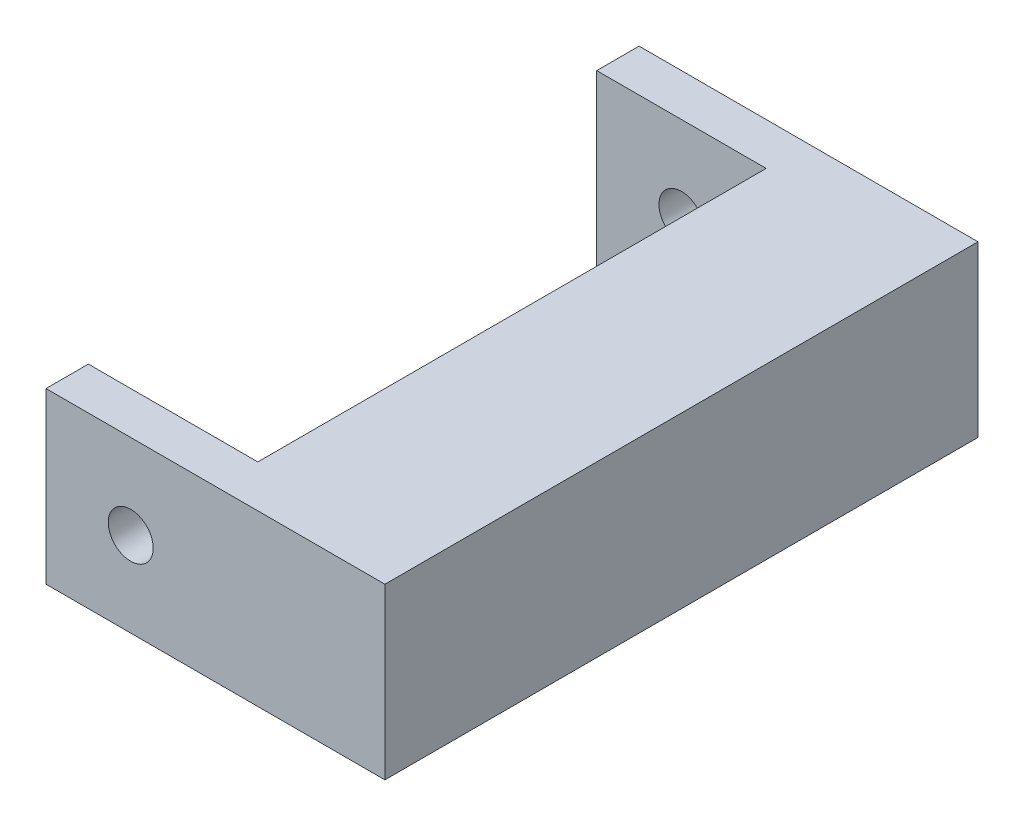
ISO-10303-21;
HEADER;
FILE_DESCRIPTION(('STEP AP214'),'2;1');
FILE_NAME('part.step','',(''),(''),'','','');
FILE_SCHEMA(('AUTOMOTIVE_DESIGN { 1 0 10303 214 1 1 1 1 }'));
ENDSEC;
DATA;
#1=APPLICATION_CONTEXT('core data for automotive mechanical design processes');
#2=APPLICATION_PROTOCOL_DEFINITION('international standard','automotive_design',2000,#1);
#3=PRODUCT_CONTEXT('',#1,'mechanical');
#4=PRODUCT('Part','Part','',(#3));
#5=PRODUCT_RELATED_PRODUCT_CATEGORY('part','',(#4));
#6=PRODUCT_DEFINITION_FORMATION('','',#4);
#7=PRODUCT_DEFINITION_CONTEXT('part definition',#1,'design');
#8=PRODUCT_DEFINITION('design','',#6,#7);
#9=PRODUCT_DEFINITION_SHAPE('','',#8);
#10=(LENGTH_UNIT() NAMED_UNIT(*) SI_UNIT(.MILLI.,.METRE.));
#11=(NAMED_UNIT(*) PLANE_ANGLE_UNIT() SI_UNIT($,.RADIAN.));
#12=(NAMED_UNIT(*) SI_UNIT($,.STERADIAN.) SOLID_ANGLE_UNIT());
#13=UNCERTAINTY_MEASURE_WITH_UNIT(LENGTH_MEASURE(1.E-05),#10,'distance_accuracy_value','');
#14=(GEOMETRIC_REPRESENTATION_CONTEXT(3) GLOBAL_UNCERTAINTY_ASSIGNED_CONTEXT((#13)) GLOBAL_UNIT_ASSIGNED_CONTEXT((#10,
#11,#12)) REPRESENTATION_CONTEXT('',''));
#15=CARTESIAN_POINT('',(0.,0.,0.));
#16=DIRECTION('',(0.,0.,1.));
#17=DIRECTION('',(1.,0.,0.));
#18=AXIS2_PLACEMENT_3D('',#15,#16,#17);
#19=CARTESIAN_POINT('',(0.,10.,5.));
#20=DIRECTION('',(0.,1.,0.));
#21=DIRECTION('',(0.,0.,1.));
#22=AXIS2_PLACEMENT_3D('',#19,#20,#21);
#23=PLANE('',#22);
#24=DIRECTION('',(1.,0.,0.));
#25=VECTOR('',#24,1.);
#26=CARTESIAN_POINT('',(0.,10.,0.));
#27=LINE('',#26,#25);
#28=CARTESIAN_POINT('',(-10.,10.,0.));
#29=VERTEX_POINT('',#28);
#30=CARTESIAN_POINT('',(30.,10.,0.));
#31=VERTEX_POINT('',#30);
#32=EDGE_CURVE('E141',#29,#31,#27,.T.);
#33=ORIENTED_EDGE('',*,*,#32,.F.);
#34=DIRECTION('',(0.,0.,-1.));
#35=VECTOR('',#34,1.);
#36=CARTESIAN_POINT('',(-10.,10.,5.));
#37=LINE('',#36,#35);
#38=CARTESIAN_POINT('',(-10.,10.,5.));
#39=VERTEX_POINT('',#38);
#40=EDGE_CURVE('E12',#39,#29,#37,.T.);
#41=ORIENTED_EDGE('',*,*,#40,.F.);
#42=DIRECTION('',(1.,0.,0.));
#43=VECTOR('',#42,1.);
#44=CARTESIAN_POINT('',(0.,10.,5.));
#45=LINE('',#44,#43);
#46=CARTESIAN_POINT('',(10.,10.,5.));
#47=VERTEX_POINT('',#46);
#48=EDGE_CURVE('E123',#39,#47,#45,.T.);
#49=ORIENTED_EDGE('',*,*,#48,.T.);
#50=DIRECTION('',(0.,0.,-1.));
#51=VECTOR('',#50,1.);
#52=CARTESIAN_POINT('',(10.,10.,70.));
#53=LINE('',#52,#51);
#54=CARTESIAN_POINT('',(10.,10.,65.));
#55=VERTEX_POINT('',#54);
#56=EDGE_CURVE('E107',#55,#47,#53,.T.);
#57=ORIENTED_EDGE('',*,*,#56,.F.);
#58=DIRECTION('',(-1.,0.,0.));
#59=VECTOR('',#58,1.);
#60=CARTESIAN_POINT('',(0.,10.,65.));
#61=LINE('',#60,#59);
#62=CARTESIAN_POINT('',(-10.,10.,65.));
#63=VERTEX_POINT('',#62);
#64=EDGE_CURVE('E344',#55,#63,#61,.T.);
#65=ORIENTED_EDGE('',*,*,#64,.T.);
#66=DIRECTION('',(0.,0.,1.));
#67=VECTOR('',#66,1.);
#68=CARTESIAN_POINT('',(-10.,10.,65.));
#69=LINE('',#68,#67);
#70=CARTESIAN_POINT('',(-10.,10.,70.));
#71=VERTEX_POINT('',#70);
#72=EDGE_CURVE('E185',#63,#71,#69,.T.);
#73=ORIENTED_EDGE('',*,*,#72,.T.);
#74=DIRECTION('',(1.,0.,0.));
#75=VECTOR('',#74,1.);
#76=CARTESIAN_POINT('',(0.,10.,70.));
#77=LINE('',#76,#75);
#78=CARTESIAN_POINT('',(30.,10.,70.));
#79=VERTEX_POINT('',#78);
#80=EDGE_CURVE('E167',#71,#79,#77,.T.);
#81=ORIENTED_EDGE('',*,*,#80,.T.);
#82=DIRECTION('',(0.,0.,-1.));
#83=VECTOR('',#82,1.);
#84=CARTESIAN_POINT('',(30.,10.,70.));
#85=LINE('',#84,#83);
#86=EDGE_CURVE('E118',#79,#31,#85,.T.);
#87=ORIENTED_EDGE('',*,*,#86,.T.);
#88=EDGE_LOOP('',(#33,#41,#49,#57,#65,#73,#81,#87));
#89=FACE_BOUND('',#88,.T.);
#90=ADVANCED_FACE('F60',(#89),#23,.T.);
#91=CARTESIAN_POINT('',(-10.,0.,5.));
#92=DIRECTION('',(1.,0.,0.));
#93=DIRECTION('',(0.,1.,0.));
#94=AXIS2_PLACEMENT_3D('',#91,#92,#93);
#95=PLANE('',#94);
#96=DIRECTION('',(0.,-1.,0.));
#97=VECTOR('',#96,1.);
#98=CARTESIAN_POINT('',(-10.,0.,0.));
#99=LINE('',#98,#97);
#100=CARTESIAN_POINT('',(-10.,-10.,0.));
#101=VERTEX_POINT('',#100);
#102=EDGE_CURVE('E145',#29,#101,#99,.T.);
#103=ORIENTED_EDGE('',*,*,#102,.T.);
#104=DIRECTION('',(0.,0.,-1.));
#105=VECTOR('',#104,1.);
#106=CARTESIAN_POINT('',(-10.,-10.,5.));
#107=LINE('',#106,#105);
#108=CARTESIAN_POINT('',(-10.,-10.,5.));
#109=VERTEX_POINT('',#108);
#110=EDGE_CURVE('E70',#109,#101,#107,.T.);
#111=ORIENTED_EDGE('',*,*,#110,.F.);
#112=DIRECTION('',(0.,-1.,0.));
#113=VECTOR('',#112,1.);
#114=CARTESIAN_POINT('',(-10.,0.,5.));
#115=LINE('',#114,#113);
#116=EDGE_CURVE('E129',#39,#109,#115,.T.);
#117=ORIENTED_EDGE('',*,*,#116,.F.);
#118=ORIENTED_EDGE('',*,*,#40,.T.);
#119=EDGE_LOOP('',(#103,#111,#117,#118));
#120=FACE_BOUND('',#119,.T.);
#121=ADVANCED_FACE('F156',(#120),#95,.F.);
#122=CARTESIAN_POINT('',(0.,0.,5.));
#123=DIRECTION('',(0.,0.,-1.));
#124=DIRECTION('',(-1.,0.,0.));
#125=AXIS2_PLACEMENT_3D('',#122,#123,#124);
#126=CYLINDRICAL_SURFACE('',#125,2.655);
#127=CARTESIAN_POINT('',(0.,0.,5.));
#128=DIRECTION('',(0.,0.,1.));
#129=DIRECTION('',(1.,0.,0.));
#130=AXIS2_PLACEMENT_3D('',#127,#128,#129);
#131=CIRCLE('',#130,2.655);
#132=CARTESIAN_POINT('',(2.655,0.,5.));
#133=VERTEX_POINT('',#132);
#134=EDGE_CURVE('E125',#133,#133,#131,.T.);
#135=ORIENTED_EDGE('',*,*,#134,.T.);
#136=EDGE_LOOP('',(#135));
#137=FACE_BOUND('',#136,.T.);
#138=CARTESIAN_POINT('',(0.,0.,0.));
#139=DIRECTION('',(0.,0.,1.));
#140=DIRECTION('',(1.,0.,0.));
#141=AXIS2_PLACEMENT_3D('',#138,#139,#140);
#142=CIRCLE('',#141,2.655);
#143=CARTESIAN_POINT('',(2.655,0.,0.));
#144=VERTEX_POINT('',#143);
#145=EDGE_CURVE('E137',#144,#144,#142,.T.);
#146=ORIENTED_EDGE('',*,*,#145,.F.);
#147=EDGE_LOOP('',(#146));
#148=FACE_BOUND('',#147,.T.);
#149=ADVANCED_FACE('F62',(#137,#148),#126,.F.);
#150=CARTESIAN_POINT('',(0.,-10.,5.));
#151=DIRECTION('',(0.,1.,0.));
#152=DIRECTION('',(0.,0.,1.));
#153=AXIS2_PLACEMENT_3D('',#150,#151,#152);
#154=PLANE('',#153);
#155=DIRECTION('',(1.,0.,0.));
#156=VECTOR('',#155,1.);
#157=CARTESIAN_POINT('',(0.,-10.,0.));
#158=LINE('',#157,#156);
#159=CARTESIAN_POINT('',(30.,-10.,0.));
#160=VERTEX_POINT('',#159);
#161=EDGE_CURVE('E148',#101,#160,#158,.T.);
#162=ORIENTED_EDGE('',*,*,#161,.T.);
#163=DIRECTION('',(0.,0.,-1.));
#164=VECTOR('',#163,1.);
#165=CARTESIAN_POINT('',(30.,-10.,70.));
#166=LINE('',#165,#164);
#167=CARTESIAN_POINT('',(30.,-10.,70.));
#168=VERTEX_POINT('',#167);
#169=EDGE_CURVE('E176',#168,#160,#166,.T.);
#170=ORIENTED_EDGE('',*,*,#169,.F.);
#171=DIRECTION('',(1.,0.,0.));
#172=VECTOR('',#171,1.);
#173=CARTESIAN_POINT('',(0.,-10.,70.));
#174=LINE('',#173,#172);
#175=CARTESIAN_POINT('',(-10.,-10.,70.));
#176=VERTEX_POINT('',#175);
#177=EDGE_CURVE('E189',#176,#168,#174,.T.);
#178=ORIENTED_EDGE('',*,*,#177,.F.);
#179=DIRECTION('',(0.,0.,1.));
#180=VECTOR('',#179,1.);
#181=CARTESIAN_POINT('',(-10.,-10.,65.));
#182=LINE('',#181,#180);
#183=CARTESIAN_POINT('',(-10.,-10.,65.));
#184=VERTEX_POINT('',#183);
#185=EDGE_CURVE('E179',#184,#176,#182,.T.);
#186=ORIENTED_EDGE('',*,*,#185,.F.);
#187=DIRECTION('',(-1.,0.,0.));
#188=VECTOR('',#187,1.);
#189=CARTESIAN_POINT('',(0.,-10.,65.));
#190=LINE('',#189,#188);
#191=CARTESIAN_POINT('',(10.,-10.,65.));
#192=VERTEX_POINT('',#191);
#193=EDGE_CURVE('E336',#192,#184,#190,.T.);
#194=ORIENTED_EDGE('',*,*,#193,.F.);
#195=DIRECTION('',(0.,0.,-1.));
#196=VECTOR('',#195,1.);
#197=CARTESIAN_POINT('',(10.,-10.,70.));
#198=LINE('',#197,#196);
#199=CARTESIAN_POINT('',(10.,-10.,5.));
#200=VERTEX_POINT('',#199);
#201=EDGE_CURVE('E95',#192,#200,#198,.T.);
#202=ORIENTED_EDGE('',*,*,#201,.T.);
#203=DIRECTION('',(1.,0.,0.));
#204=VECTOR('',#203,1.);
#205=CARTESIAN_POINT('',(0.,-10.,5.));
#206=LINE('',#205,#204);
#207=EDGE_CURVE('E78',#109,#200,#206,.T.);
#208=ORIENTED_EDGE('',*,*,#207,.F.);
#209=ORIENTED_EDGE('',*,*,#110,.T.);
#210=EDGE_LOOP('',(#162,#170,#178,#186,#194,#202,#208,#209));
#211=FACE_BOUND('',#210,.T.);
#212=ADVANCED_FACE('F153',(#211),#154,.F.);
#213=CARTESIAN_POINT('',(0.,0.,5.));
#214=DIRECTION('',(0.,0.,1.));
#215=DIRECTION('',(1.,0.,0.));
#216=AXIS2_PLACEMENT_3D('',#213,#214,#215);
#217=PLANE('',#216);
#218=ORIENTED_EDGE('',*,*,#134,.F.);
#219=EDGE_LOOP('',(#218));
#220=FACE_BOUND('',#219,.T.);
#221=DIRECTION('',(0.,-1.,0.));
#222=VECTOR('',#221,1.);
#223=CARTESIAN_POINT('',(10.,0.,5.));
#224=LINE('',#223,#222);
#225=EDGE_CURVE('E110',#47,#200,#224,.T.);
#226=ORIENTED_EDGE('',*,*,#225,.F.);
#227=ORIENTED_EDGE('',*,*,#48,.F.);
#228=ORIENTED_EDGE('',*,*,#116,.T.);
#229=ORIENTED_EDGE('',*,*,#207,.T.);
#230=EDGE_LOOP('',(#226,#227,#228,#229));
#231=FACE_BOUND('',#230,.T.);
#232=ADVANCED_FACE('F122',(#220,#231),#217,.T.);
#233=CARTESIAN_POINT('',(0.,0.,0.));
#234=DIRECTION('',(0.,0.,1.));
#235=DIRECTION('',(1.,0.,0.));
#236=AXIS2_PLACEMENT_3D('',#233,#234,#235);
#237=PLANE('',#236);
#238=ORIENTED_EDGE('',*,*,#145,.T.);
#239=EDGE_LOOP('',(#238));
#240=FACE_BOUND('',#239,.T.);
#241=ORIENTED_EDGE('',*,*,#32,.T.);
#242=DIRECTION('',(0.,-1.,0.));
#243=VECTOR('',#242,1.);
#244=CARTESIAN_POINT('',(30.,0.,0.));
#245=LINE('',#244,#243);
#246=EDGE_CURVE('E174',#31,#160,#245,.T.);
#247=ORIENTED_EDGE('',*,*,#246,.T.);
#248=ORIENTED_EDGE('',*,*,#161,.F.);
#249=ORIENTED_EDGE('',*,*,#102,.F.);
#250=EDGE_LOOP('',(#241,#247,#248,#249));
#251=FACE_BOUND('',#250,.T.);
#252=ADVANCED_FACE('F158',(#240,#251),#237,.F.);
#253=CARTESIAN_POINT('',(10.,0.,70.));
#254=DIRECTION('',(1.,0.,0.));
#255=DIRECTION('',(0.,1.,0.));
#256=AXIS2_PLACEMENT_3D('',#253,#254,#255);
#257=PLANE('',#256);
#258=ORIENTED_EDGE('',*,*,#201,.F.);
#259=DIRECTION('',(0.,1.,0.));
#260=VECTOR('',#259,1.);
#261=CARTESIAN_POINT('',(10.,0.,65.));
#262=LINE('',#261,#260);
#263=EDGE_CURVE('E113',#192,#55,#262,.T.);
#264=ORIENTED_EDGE('',*,*,#263,.T.);
#265=ORIENTED_EDGE('',*,*,#56,.T.);
#266=ORIENTED_EDGE('',*,*,#225,.T.);
#267=EDGE_LOOP('',(#258,#264,#265,#266));
#268=FACE_BOUND('',#267,.T.);
#269=ADVANCED_FACE('F109',(#268),#257,.F.);
#270=CARTESIAN_POINT('',(30.,0.,70.));
#271=DIRECTION('',(1.,0.,0.));
#272=DIRECTION('',(0.,1.,0.));
#273=AXIS2_PLACEMENT_3D('',#270,#271,#272);
#274=PLANE('',#273);
#275=ORIENTED_EDGE('',*,*,#246,.F.);
#276=ORIENTED_EDGE('',*,*,#86,.F.);
#277=DIRECTION('',(0.,-1.,0.));
#278=VECTOR('',#277,1.);
#279=CARTESIAN_POINT('',(30.,0.,70.));
#280=LINE('',#279,#278);
#281=EDGE_CURVE('E178',#79,#168,#280,.T.);
#282=ORIENTED_EDGE('',*,*,#281,.T.);
#283=ORIENTED_EDGE('',*,*,#169,.T.);
#284=EDGE_LOOP('',(#275,#276,#282,#283));
#285=FACE_BOUND('',#284,.T.);
#286=ADVANCED_FACE('F175',(#285),#274,.T.);
#287=CARTESIAN_POINT('',(0.,0.,70.));
#288=DIRECTION('',(0.,0.,1.));
#289=DIRECTION('',(1.,0.,0.));
#290=AXIS2_PLACEMENT_3D('',#287,#288,#289);
#291=PLANE('',#290);
#292=ORIENTED_EDGE('',*,*,#281,.F.);
#293=ORIENTED_EDGE('',*,*,#80,.F.);
#294=DIRECTION('',(0.,1.,0.));
#295=VECTOR('',#294,1.);
#296=CARTESIAN_POINT('',(-10.,0.,70.));
#297=LINE('',#296,#295);
#298=EDGE_CURVE('E333',#176,#71,#297,.T.);
#299=ORIENTED_EDGE('',*,*,#298,.F.);
#300=ORIENTED_EDGE('',*,*,#177,.T.);
#301=EDGE_LOOP('',(#292,#293,#299,#300));
#302=FACE_BOUND('',#301,.T.);
#303=CARTESIAN_POINT('',(0.,0.,70.));
#304=DIRECTION('',(0.,0.,1.));
#305=DIRECTION('',(1.,0.,0.));
#306=AXIS2_PLACEMENT_3D('',#303,#304,#305);
#307=CIRCLE('',#306,2.655);
#308=CARTESIAN_POINT('',(2.655,0.,70.));
#309=VERTEX_POINT('',#308);
#310=EDGE_CURVE('E328',#309,#309,#307,.T.);
#311=ORIENTED_EDGE('',*,*,#310,.F.);
#312=EDGE_LOOP('',(#311));
#313=FACE_BOUND('',#312,.T.);
#314=ADVANCED_FACE('F261',(#302,#313),#291,.T.);
#315=CARTESIAN_POINT('',(-10.,0.,65.));
#316=DIRECTION('',(1.,0.,0.));
#317=DIRECTION('',(0.,1.,0.));
#318=AXIS2_PLACEMENT_3D('',#315,#316,#317);
#319=PLANE('',#318);
#320=ORIENTED_EDGE('',*,*,#298,.T.);
#321=ORIENTED_EDGE('',*,*,#72,.F.);
#322=DIRECTION('',(0.,1.,0.));
#323=VECTOR('',#322,1.);
#324=CARTESIAN_POINT('',(-10.,0.,65.));
#325=LINE('',#324,#323);
#326=EDGE_CURVE('E340',#184,#63,#325,.T.);
#327=ORIENTED_EDGE('',*,*,#326,.F.);
#328=ORIENTED_EDGE('',*,*,#185,.T.);
#329=EDGE_LOOP('',(#320,#321,#327,#328));
#330=FACE_BOUND('',#329,.T.);
#331=ADVANCED_FACE('F275',(#330),#319,.F.);
#332=CARTESIAN_POINT('',(0.,0.,65.));
#333=DIRECTION('',(0.,0.,-1.));
#334=DIRECTION('',(-1.,0.,0.));
#335=AXIS2_PLACEMENT_3D('',#332,#333,#334);
#336=PLANE('',#335);
#337=CARTESIAN_POINT('',(0.,0.,65.));
#338=DIRECTION('',(0.,0.,1.));
#339=DIRECTION('',(1.,0.,0.));
#340=AXIS2_PLACEMENT_3D('',#337,#338,#339);
#341=CIRCLE('',#340,2.655);
#342=CARTESIAN_POINT('',(2.655,0.,65.));
#343=VERTEX_POINT('',#342);
#344=EDGE_CURVE('E325',#343,#343,#341,.T.);
#345=ORIENTED_EDGE('',*,*,#344,.T.);
#346=EDGE_LOOP('',(#345));
#347=FACE_BOUND('',#346,.T.);
#348=ORIENTED_EDGE('',*,*,#193,.T.);
#349=ORIENTED_EDGE('',*,*,#326,.T.);
#350=ORIENTED_EDGE('',*,*,#64,.F.);
#351=ORIENTED_EDGE('',*,*,#263,.F.);
#352=EDGE_LOOP('',(#348,#349,#350,#351));
#353=FACE_BOUND('',#352,.T.);
#354=ADVANCED_FACE('F284',(#347,#353),#336,.T.);
#355=CARTESIAN_POINT('',(0.,0.,65.));
#356=DIRECTION('',(0.,0.,1.));
#357=DIRECTION('',(1.,0.,0.));
#358=AXIS2_PLACEMENT_3D('',#355,#356,#357);
#359=CYLINDRICAL_SURFACE('',#358,2.655);
#360=ORIENTED_EDGE('',*,*,#344,.F.);
#361=EDGE_LOOP('',(#360));
#362=FACE_BOUND('',#361,.T.);
#363=ORIENTED_EDGE('',*,*,#310,.T.);
#364=EDGE_LOOP('',(#363));
#365=FACE_BOUND('',#364,.T.);
#366=ADVANCED_FACE('F294',(#362,#365),#359,.F.);
#367=CLOSED_SHELL('',(#90,#121,#149,#212,#232,#252,#269,#286,#314,#331,#354,#366));
#368=MANIFOLD_SOLID_BREP('B2',#367);
#369=ADVANCED_BREP_SHAPE_REPRESENTATION('',(#18,#368),#14);
#370=SHAPE_DEFINITION_REPRESENTATION(#9,#369);
ENDSEC;
END-ISO-10303-21;
